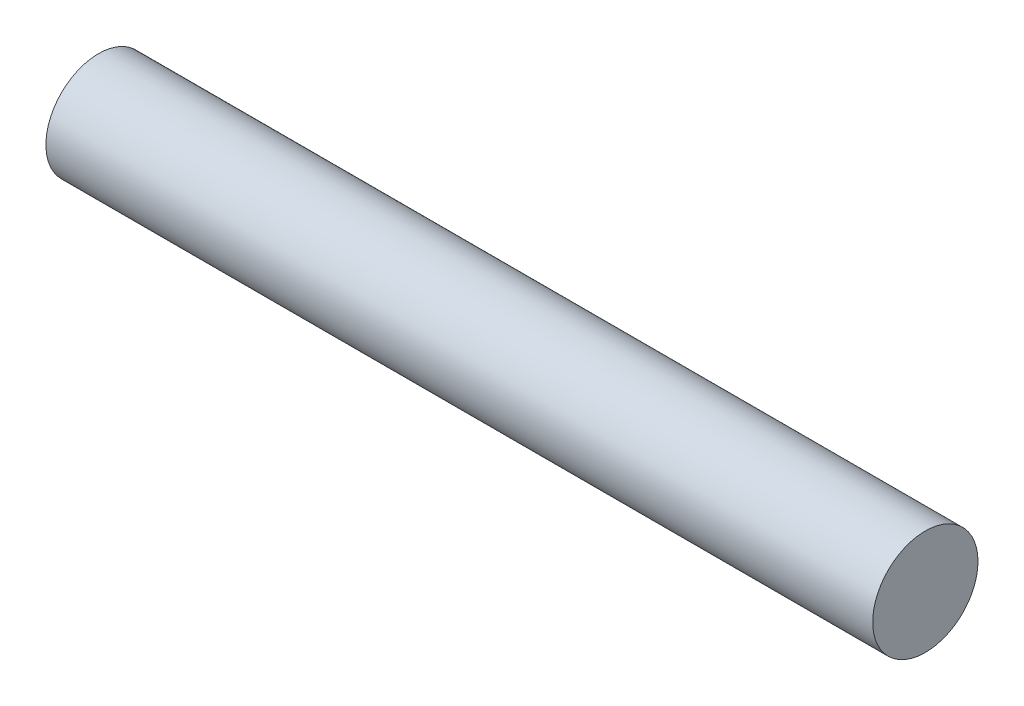
ISO-10303-21;
HEADER;
FILE_DESCRIPTION(('STEP AP214'),'2;1');
FILE_NAME('part.step','',(''),(''),'','','');
FILE_SCHEMA(('AUTOMOTIVE_DESIGN { 1 0 10303 214 1 1 1 1 }'));
ENDSEC;
DATA;
#1=APPLICATION_CONTEXT('core data for automotive mechanical design processes');
#2=APPLICATION_PROTOCOL_DEFINITION('international standard','automotive_design',2000,#1);
#3=PRODUCT_CONTEXT('',#1,'mechanical');
#4=PRODUCT('Part','Part','',(#3));
#5=PRODUCT_RELATED_PRODUCT_CATEGORY('part','',(#4));
#6=PRODUCT_DEFINITION_FORMATION('','',#4);
#7=PRODUCT_DEFINITION_CONTEXT('part definition',#1,'design');
#8=PRODUCT_DEFINITION('design','',#6,#7);
#9=PRODUCT_DEFINITION_SHAPE('','',#8);
#10=(LENGTH_UNIT() NAMED_UNIT(*) SI_UNIT(.MILLI.,.METRE.));
#11=(NAMED_UNIT(*) PLANE_ANGLE_UNIT() SI_UNIT($,.RADIAN.));
#12=(NAMED_UNIT(*) SI_UNIT($,.STERADIAN.) SOLID_ANGLE_UNIT());
#13=UNCERTAINTY_MEASURE_WITH_UNIT(LENGTH_MEASURE(1.E-05),#10,'distance_accuracy_value','');
#14=(GEOMETRIC_REPRESENTATION_CONTEXT(3) GLOBAL_UNCERTAINTY_ASSIGNED_CONTEXT((#13)) GLOBAL_UNIT_ASSIGNED_CONTEXT((#10,
#11,#12)) REPRESENTATION_CONTEXT('',''));
#15=CARTESIAN_POINT('',(0.,0.,0.));
#16=DIRECTION('',(0.,0.,1.));
#17=DIRECTION('',(1.,0.,0.));
#18=AXIS2_PLACEMENT_3D('',#15,#16,#17);
#19=CARTESIAN_POINT('',(199.39,0.,0.));
#20=DIRECTION('',(-1.,0.,0.));
#21=DIRECTION('',(0.,0.,1.));
#22=AXIS2_PLACEMENT_3D('',#19,#20,#21);
#23=CYLINDRICAL_SURFACE('',#22,12.7);
#24=CARTESIAN_POINT('',(199.39,0.,0.));
#25=DIRECTION('',(1.,0.,0.));
#26=DIRECTION('',(0.,0.,-1.));
#27=AXIS2_PLACEMENT_3D('',#24,#25,#26);
#28=CIRCLE('',#27,12.7);
#29=CARTESIAN_POINT('',(199.39,0.,-12.7));
#30=VERTEX_POINT('',#29);
#31=EDGE_CURVE('E10',#30,#30,#28,.T.);
#32=ORIENTED_EDGE('',*,*,#31,.F.);
#33=EDGE_LOOP('',(#32));
#34=FACE_BOUND('',#33,.T.);
#35=CARTESIAN_POINT('',(0.,0.,0.));
#36=DIRECTION('',(1.,0.,0.));
#37=DIRECTION('',(0.,0.,-1.));
#38=AXIS2_PLACEMENT_3D('',#35,#36,#37);
#39=CIRCLE('',#38,12.7);
#40=CARTESIAN_POINT('',(0.,0.,-12.7));
#41=VERTEX_POINT('',#40);
#42=EDGE_CURVE('E46',#41,#41,#39,.T.);
#43=ORIENTED_EDGE('',*,*,#42,.T.);
#44=EDGE_LOOP('',(#43));
#45=FACE_BOUND('',#44,.T.);
#46=ADVANCED_FACE('F43',(#34,#45),#23,.T.);
#47=CARTESIAN_POINT('',(199.39,0.,0.));
#48=DIRECTION('',(1.,0.,0.));
#49=DIRECTION('',(0.,0.,-1.));
#50=AXIS2_PLACEMENT_3D('',#47,#48,#49);
#51=PLANE('',#50);
#52=ORIENTED_EDGE('',*,*,#31,.T.);
#53=EDGE_LOOP('',(#52));
#54=FACE_BOUND('',#53,.T.);
#55=ADVANCED_FACE('F58',(#54),#51,.T.);
#56=CARTESIAN_POINT('',(0.,0.,0.));
#57=DIRECTION('',(1.,0.,0.));
#58=DIRECTION('',(0.,0.,-1.));
#59=AXIS2_PLACEMENT_3D('',#56,#57,#58);
#60=PLANE('',#59);
#61=ORIENTED_EDGE('',*,*,#42,.F.);
#62=EDGE_LOOP('',(#61));
#63=FACE_BOUND('',#62,.T.);
#64=ADVANCED_FACE('F56',(#63),#60,.F.);
#65=CLOSED_SHELL('',(#46,#55,#64));
#66=MANIFOLD_SOLID_BREP('B2',#65);
#67=ADVANCED_BREP_SHAPE_REPRESENTATION('',(#18,#66),#14);
#68=SHAPE_DEFINITION_REPRESENTATION(#9,#67);
ENDSEC;
END-ISO-10303-21;
